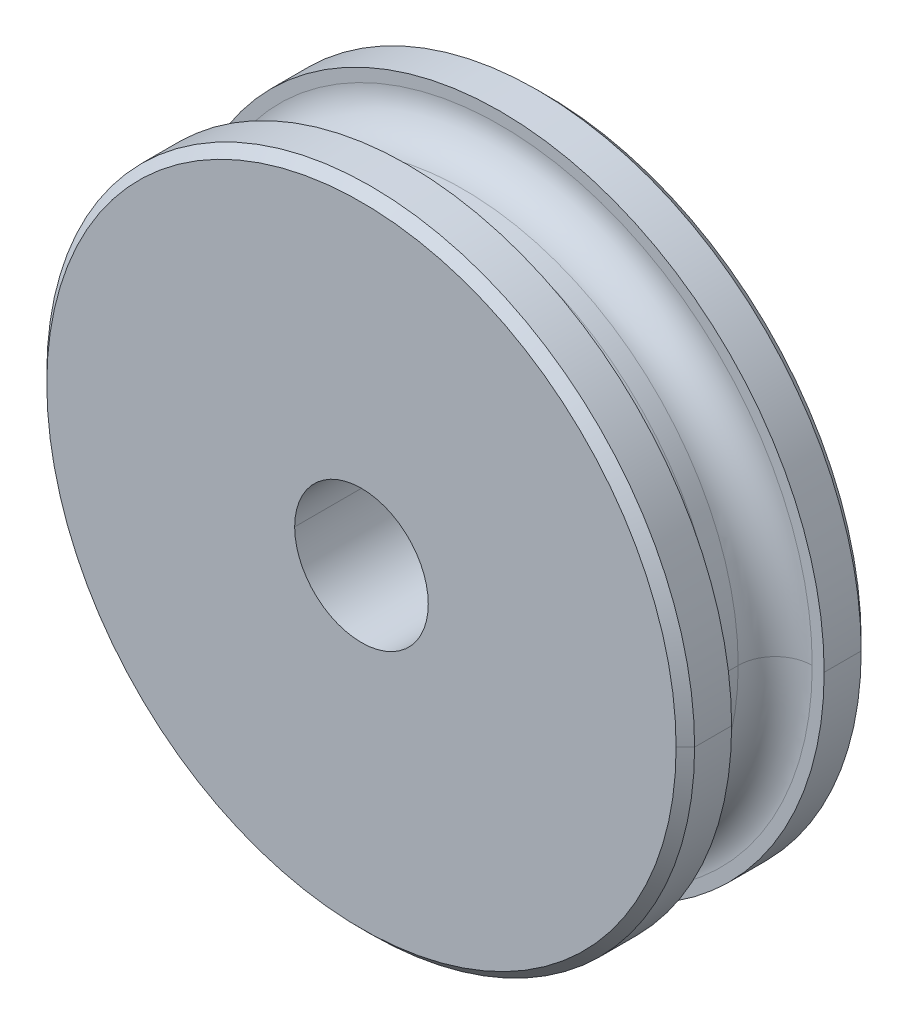
ISO-10303-21;
HEADER;
FILE_DESCRIPTION(('STEP AP214'),'2;1');
FILE_NAME('part.step','',(''),(''),'','','');
FILE_SCHEMA(('AUTOMOTIVE_DESIGN { 1 0 10303 214 1 1 1 1 }'));
ENDSEC;
DATA;
#1=APPLICATION_CONTEXT('core data for automotive mechanical design processes');
#2=APPLICATION_PROTOCOL_DEFINITION('international standard','automotive_design',2000,#1);
#3=PRODUCT_CONTEXT('',#1,'mechanical');
#4=PRODUCT('Part','Part','',(#3));
#5=PRODUCT_RELATED_PRODUCT_CATEGORY('part','',(#4));
#6=PRODUCT_DEFINITION_FORMATION('','',#4);
#7=PRODUCT_DEFINITION_CONTEXT('part definition',#1,'design');
#8=PRODUCT_DEFINITION('design','',#6,#7);
#9=PRODUCT_DEFINITION_SHAPE('','',#8);
#10=(LENGTH_UNIT() NAMED_UNIT(*) SI_UNIT(.MILLI.,.METRE.));
#11=(NAMED_UNIT(*) PLANE_ANGLE_UNIT() SI_UNIT($,.RADIAN.));
#12=(NAMED_UNIT(*) SI_UNIT($,.STERADIAN.) SOLID_ANGLE_UNIT());
#13=UNCERTAINTY_MEASURE_WITH_UNIT(LENGTH_MEASURE(1.E-05),#10,'distance_accuracy_value','');
#14=(GEOMETRIC_REPRESENTATION_CONTEXT(3) GLOBAL_UNCERTAINTY_ASSIGNED_CONTEXT((#13)) GLOBAL_UNIT_ASSIGNED_CONTEXT((#10,
#11,#12)) REPRESENTATION_CONTEXT('',''));
#15=CARTESIAN_POINT('',(0.,0.,0.));
#16=DIRECTION('',(0.,0.,1.));
#17=DIRECTION('',(1.,0.,0.));
#18=AXIS2_PLACEMENT_3D('',#15,#16,#17);
#19=CARTESIAN_POINT('',(2813.58845603353,799.187242222488,-1.99999999999889));
#20=DIRECTION('',(0.,0.,1.));
#21=DIRECTION('',(0.999986330920326,-0.00522857270246895,0.));
#22=AXIS2_PLACEMENT_3D('',#19,#20,#21);
#23=TOROIDAL_SURFACE('',#22,67.4206294946856,8.);
#24=CARTESIAN_POINT('',(2813.58845603353,799.187242222488,-1.99999999999889));
#25=DIRECTION('',(0.,0.,1.));
#26=DIRECTION('',(1.,0.,0.));
#27=AXIS2_PLACEMENT_3D('',#24,#25,#26);
#28=CIRCLE('',#27,59.4206294946865);
#29=CARTESIAN_POINT('',(2873.00908552821,799.187242222497,-1.99999999999889));
#30=VERTEX_POINT('',#29);
#31=CARTESIAN_POINT('',(2754.16782653884,799.187242222484,-2.00000000000022));
#32=VERTEX_POINT('',#31);
#33=EDGE_CURVE('E118',#30,#32,#28,.T.);
#34=ORIENTED_EDGE('',*,*,#33,.F.);
#35=CARTESIAN_POINT('',(2881.00908552821,799.187242222525,-1.99999999999889));
#36=DIRECTION('',(-5.50448575609153E-13,1.,0.));
#37=DIRECTION('',(1.,5.55666623824891E-13,0.));
#38=AXIS2_PLACEMENT_3D('',#35,#36,#37);
#39=CIRCLE('',#38,8.);
#40=CARTESIAN_POINT('',(2881.00908552821,799.187242222503,-9.9999999999989));
#41=VERTEX_POINT('',#40);
#42=EDGE_CURVE('E111',#30,#41,#39,.F.);
#43=ORIENTED_EDGE('',*,*,#42,.T.);
#44=CARTESIAN_POINT('',(2813.58845603353,799.187242222488,-9.99999999999891));
#45=DIRECTION('',(0.,0.,1.));
#46=DIRECTION('',(1.,0.,0.));
#47=AXIS2_PLACEMENT_3D('',#44,#45,#46);
#48=CIRCLE('',#47,67.420629494686);
#49=CARTESIAN_POINT('',(2746.16782653884,799.187242222481,-10.0000000000002));
#50=VERTEX_POINT('',#49);
#51=EDGE_CURVE('E105',#50,#41,#48,.F.);
#52=ORIENTED_EDGE('',*,*,#51,.F.);
#53=CARTESIAN_POINT('',(2746.16782653884,799.187242222489,-2.00000000000022));
#54=DIRECTION('',(0.,-1.,0.));
#55=DIRECTION('',(-1.,0.,0.));
#56=AXIS2_PLACEMENT_3D('',#53,#54,#55);
#57=CIRCLE('',#56,8.);
#58=EDGE_CURVE('E109',#50,#32,#57,.T.);
#59=ORIENTED_EDGE('',*,*,#58,.T.);
#60=EDGE_LOOP('',(#34,#43,#52,#59));
#61=FACE_BOUND('',#60,.T.);
#62=ADVANCED_FACE('F16',(#61),#23,.F.);
#63=CARTESIAN_POINT('',(2813.58845603353,799.187242222488,-2.00000000000022));
#64=DIRECTION('',(0.,0.,1.));
#65=DIRECTION('',(-0.999986330920326,0.00522857270247547,0.));
#66=AXIS2_PLACEMENT_3D('',#63,#64,#65);
#67=TOROIDAL_SURFACE('',#66,67.4206294946865,8.);
#68=CARTESIAN_POINT('',(2813.58845603353,799.187242222488,-1.99999999999889));
#69=DIRECTION('',(0.,0.,1.));
#70=DIRECTION('',(1.,0.,0.));
#71=AXIS2_PLACEMENT_3D('',#68,#69,#70);
#72=CIRCLE('',#71,59.4206294946865);
#73=EDGE_CURVE('E123',#32,#30,#72,.T.);
#74=ORIENTED_EDGE('',*,*,#73,.F.);
#75=ORIENTED_EDGE('',*,*,#58,.F.);
#76=CARTESIAN_POINT('',(2813.58845603353,799.187242222488,-10.0000000000002));
#77=DIRECTION('',(0.,0.,1.));
#78=DIRECTION('',(-1.,0.,0.));
#79=AXIS2_PLACEMENT_3D('',#76,#77,#78);
#80=CIRCLE('',#79,67.4206294946864);
#81=EDGE_CURVE('E117',#41,#50,#80,.F.);
#82=ORIENTED_EDGE('',*,*,#81,.F.);
#83=ORIENTED_EDGE('',*,*,#42,.F.);
#84=EDGE_LOOP('',(#74,#75,#82,#83));
#85=FACE_BOUND('',#84,.T.);
#86=ADVANCED_FACE('F121',(#85),#67,.F.);
#87=CARTESIAN_POINT('',(2813.58845603353,799.187242222488,10.0000000000011));
#88=DIRECTION('',(0.,0.,1.));
#89=DIRECTION('',(1.,0.,0.));
#90=AXIS2_PLACEMENT_3D('',#87,#88,#89);
#91=CYLINDRICAL_SURFACE('',#90,59.4206294946865);
#92=DIRECTION('',(0.,0.,1.));
#93=VECTOR('',#92,1.);
#94=CARTESIAN_POINT('',(2754.16782653884,799.187242222488,9.99999999999979));
#95=LINE('',#94,#93);
#96=CARTESIAN_POINT('',(2754.16782653884,799.187242222492,1.99999999999978));
#97=VERTEX_POINT('',#96);
#98=EDGE_CURVE('E185',#32,#97,#95,.T.);
#99=ORIENTED_EDGE('',*,*,#98,.F.);
#100=ORIENTED_EDGE('',*,*,#73,.T.);
#101=DIRECTION('',(0.,0.,1.));
#102=VECTOR('',#101,1.);
#103=CARTESIAN_POINT('',(2873.00908552821,799.187242222488,10.0000000000011));
#104=LINE('',#103,#102);
#105=CARTESIAN_POINT('',(2873.00908552821,799.187242222475,2.00000000000111));
#106=VERTEX_POINT('',#105);
#107=EDGE_CURVE('E88',#106,#30,#104,.F.);
#108=ORIENTED_EDGE('',*,*,#107,.F.);
#109=CARTESIAN_POINT('',(2813.58845603353,799.187242222488,2.00000000000111));
#110=DIRECTION('',(0.,0.,1.));
#111=DIRECTION('',(0.99997241615736,0.00742744400270856,0.));
#112=AXIS2_PLACEMENT_3D('',#109,#110,#111);
#113=CIRCLE('',#112,59.4206294946864);
#114=EDGE_CURVE('E130',#106,#97,#113,.F.);
#115=ORIENTED_EDGE('',*,*,#114,.T.);
#116=EDGE_LOOP('',(#99,#100,#108,#115));
#117=FACE_BOUND('',#116,.T.);
#118=ADVANCED_FACE('F157',(#117),#91,.T.);
#119=CARTESIAN_POINT('',(2813.58845603353,799.187242222488,10.0000000000011));
#120=DIRECTION('',(0.,0.,1.));
#121=DIRECTION('',(1.,0.,0.));
#122=AXIS2_PLACEMENT_3D('',#119,#120,#121);
#123=CYLINDRICAL_SURFACE('',#122,59.4206294946865);
#124=ORIENTED_EDGE('',*,*,#107,.T.);
#125=ORIENTED_EDGE('',*,*,#33,.T.);
#126=ORIENTED_EDGE('',*,*,#98,.T.);
#127=CARTESIAN_POINT('',(2813.58845603353,799.187242222488,2.00000000000111));
#128=DIRECTION('',(0.,0.,1.));
#129=DIRECTION('',(-0.99997241615736,-0.00742744400271039,0.));
#130=AXIS2_PLACEMENT_3D('',#127,#128,#129);
#131=CIRCLE('',#130,59.4206294946864);
#132=EDGE_CURVE('E280',#97,#106,#131,.F.);
#133=ORIENTED_EDGE('',*,*,#132,.T.);
#134=EDGE_LOOP('',(#124,#125,#126,#133));
#135=FACE_BOUND('',#134,.T.);
#136=ADVANCED_FACE('F150',(#135),#123,.T.);
#137=CARTESIAN_POINT('',(0.,3.33066907387547E-13,-9.99999999999979));
#138=DIRECTION('',(0.,0.,1.));
#139=DIRECTION('',(1.,0.,0.));
#140=AXIS2_PLACEMENT_3D('',#137,#138,#139);
#141=PLANE('',#140);
#142=ORIENTED_EDGE('',*,*,#51,.T.);
#143=ORIENTED_EDGE('',*,*,#81,.T.);
#144=EDGE_LOOP('',(#142,#143));
#145=FACE_BOUND('',#144,.T.);
#146=CARTESIAN_POINT('',(2813.58845603353,799.187242222488,-9.9999999999989));
#147=DIRECTION('',(0.,0.,1.));
#148=DIRECTION('',(1.,0.,0.));
#149=AXIS2_PLACEMENT_3D('',#146,#147,#148);
#150=CIRCLE('',#149,70.);
#151=CARTESIAN_POINT('',(2883.58845603353,799.187242222488,-9.9999999999989));
#152=VERTEX_POINT('',#151);
#153=CARTESIAN_POINT('',(2743.58845603353,799.187242222488,-10.0000000000002));
#154=VERTEX_POINT('',#153);
#155=EDGE_CURVE('E21',#152,#154,#150,.F.);
#156=ORIENTED_EDGE('',*,*,#155,.F.);
#157=CARTESIAN_POINT('',(2813.58845603353,799.187242222488,-9.9999999999989));
#158=DIRECTION('',(0.,0.,1.));
#159=DIRECTION('',(1.,0.,0.));
#160=AXIS2_PLACEMENT_3D('',#157,#158,#159);
#161=CIRCLE('',#160,70.);
#162=EDGE_CURVE('E236',#154,#152,#161,.F.);
#163=ORIENTED_EDGE('',*,*,#162,.F.);
#164=EDGE_LOOP('',(#156,#163));
#165=FACE_BOUND('',#164,.T.);
#166=ADVANCED_FACE('F128',(#145,#165),#141,.T.);
#167=CARTESIAN_POINT('',(2813.58845603353,799.187242222488,2.00000000000111));
#168=DIRECTION('',(0.,0.,1.));
#169=DIRECTION('',(0.999972416157359,0.00742744400271087,0.));
#170=AXIS2_PLACEMENT_3D('',#167,#168,#169);
#171=TOROIDAL_SURFACE('',#170,67.4206294946858,8.);
#172=ORIENTED_EDGE('',*,*,#114,.F.);
#173=CARTESIAN_POINT('',(2881.00908552821,799.187242222468,2.00000000000111));
#174=DIRECTION('',(2.95319324550292E-13,1.,0.));
#175=DIRECTION('',(1.,-2.9171109972026E-13,0.));
#176=AXIS2_PLACEMENT_3D('',#173,#174,#175);
#177=CIRCLE('',#176,8.);
#178=CARTESIAN_POINT('',(2881.00908552821,799.187242222481,10.0000000000011));
#179=VERTEX_POINT('',#178);
#180=EDGE_CURVE('E253',#106,#179,#177,.T.);
#181=ORIENTED_EDGE('',*,*,#180,.T.);
#182=CARTESIAN_POINT('',(2813.58845603353,799.187242222488,10.0000000000011));
#183=DIRECTION('',(0.,0.,-1.));
#184=DIRECTION('',(1.,0.,0.));
#185=AXIS2_PLACEMENT_3D('',#182,#183,#184);
#186=CIRCLE('',#185,67.420629494686);
#187=CARTESIAN_POINT('',(2746.16782653884,799.187242222492,9.99999999999979));
#188=VERTEX_POINT('',#187);
#189=EDGE_CURVE('E247',#179,#188,#186,.T.);
#190=ORIENTED_EDGE('',*,*,#189,.T.);
#191=CARTESIAN_POINT('',(2746.16782653884,799.187242222487,1.99999999999978));
#192=DIRECTION('',(0.,-1.,0.));
#193=DIRECTION('',(-1.,0.,0.));
#194=AXIS2_PLACEMENT_3D('',#191,#192,#193);
#195=CIRCLE('',#194,8.);
#196=EDGE_CURVE('E283',#188,#97,#195,.F.);
#197=ORIENTED_EDGE('',*,*,#196,.T.);
#198=EDGE_LOOP('',(#172,#181,#190,#197));
#199=FACE_BOUND('',#198,.T.);
#200=ADVANCED_FACE('F149',(#199),#171,.F.);
#201=CARTESIAN_POINT('',(2813.58845603353,799.187242222488,1.99999999999978));
#202=DIRECTION('',(0.,0.,1.));
#203=DIRECTION('',(-0.999972416157359,-0.00742744400270588,0.));
#204=AXIS2_PLACEMENT_3D('',#201,#202,#203);
#205=TOROIDAL_SURFACE('',#204,67.4206294946863,8.);
#206=ORIENTED_EDGE('',*,*,#132,.F.);
#207=ORIENTED_EDGE('',*,*,#196,.F.);
#208=CARTESIAN_POINT('',(2813.58845603353,799.187242222488,9.99999999999979));
#209=DIRECTION('',(0.,0.,-1.));
#210=DIRECTION('',(-1.,0.,0.));
#211=AXIS2_PLACEMENT_3D('',#208,#209,#210);
#212=CIRCLE('',#211,67.420629494686);
#213=EDGE_CURVE('E309',#188,#179,#212,.T.);
#214=ORIENTED_EDGE('',*,*,#213,.T.);
#215=ORIENTED_EDGE('',*,*,#180,.F.);
#216=EDGE_LOOP('',(#206,#207,#214,#215));
#217=FACE_BOUND('',#216,.T.);
#218=ADVANCED_FACE('F263',(#217),#205,.F.);
#219=CARTESIAN_POINT('',(2813.58845603353,799.187242222488,-19.9999999999987));
#220=DIRECTION('',(0.,0.,1.));
#221=DIRECTION('',(1.,0.,0.));
#222=AXIS2_PLACEMENT_3D('',#219,#220,#221);
#223=CYLINDRICAL_SURFACE('',#222,70.);
#224=DIRECTION('',(0.,0.,1.));
#225=VECTOR('',#224,1.);
#226=CARTESIAN_POINT('',(2743.58845603353,799.187242222488,-20.));
#227=LINE('',#226,#225);
#228=CARTESIAN_POINT('',(2743.58845603385,799.187242182791,-18.0000000004483));
#229=VERTEX_POINT('',#228);
#230=EDGE_CURVE('E240',#229,#154,#227,.T.);
#231=ORIENTED_EDGE('',*,*,#230,.F.);
#232=CARTESIAN_POINT('',(2813.58845603353,799.187242222488,-18.0000000004257));
#233=DIRECTION('',(0.,0.,1.));
#234=DIRECTION('',(0.,-1.,0.));
#235=AXIS2_PLACEMENT_3D('',#232,#233,#234);
#236=CIRCLE('',#235,69.9999999995816);
#237=CARTESIAN_POINT('',(2883.58845603319,799.187242147957,-18.0000000003333));
#238=VERTEX_POINT('',#237);
#239=EDGE_CURVE('E315',#238,#229,#236,.F.);
#240=ORIENTED_EDGE('',*,*,#239,.F.);
#241=DIRECTION('',(0.,0.,1.));
#242=VECTOR('',#241,1.);
#243=CARTESIAN_POINT('',(2883.58845603353,799.187242222488,-19.9999999999987));
#244=LINE('',#243,#242);
#245=EDGE_CURVE('E239',#152,#238,#244,.F.);
#246=ORIENTED_EDGE('',*,*,#245,.F.);
#247=ORIENTED_EDGE('',*,*,#155,.T.);
#248=EDGE_LOOP('',(#231,#240,#246,#247));
#249=FACE_BOUND('',#248,.T.);
#250=ADVANCED_FACE('F267',(#249),#223,.T.);
#251=CARTESIAN_POINT('',(2813.58845603353,799.187242222488,-19.9999999999987));
#252=DIRECTION('',(0.,0.,1.));
#253=DIRECTION('',(1.,0.,0.));
#254=AXIS2_PLACEMENT_3D('',#251,#252,#253);
#255=CYLINDRICAL_SURFACE('',#254,70.);
#256=ORIENTED_EDGE('',*,*,#245,.T.);
#257=CARTESIAN_POINT('',(2813.58845603353,799.187242222488,-18.0000000004257));
#258=DIRECTION('',(0.,0.,1.));
#259=DIRECTION('',(0.,-1.,0.));
#260=AXIS2_PLACEMENT_3D('',#257,#258,#259);
#261=CIRCLE('',#260,69.9999999995816);
#262=EDGE_CURVE('E389',#229,#238,#261,.F.);
#263=ORIENTED_EDGE('',*,*,#262,.F.);
#264=ORIENTED_EDGE('',*,*,#230,.T.);
#265=ORIENTED_EDGE('',*,*,#162,.T.);
#266=EDGE_LOOP('',(#256,#263,#264,#265));
#267=FACE_BOUND('',#266,.T.);
#268=ADVANCED_FACE('F334',(#267),#255,.T.);
#269=CARTESIAN_POINT('',(0.,0.,9.99999999999979));
#270=DIRECTION('',(0.,0.,1.));
#271=DIRECTION('',(1.,0.,0.));
#272=AXIS2_PLACEMENT_3D('',#269,#270,#271);
#273=PLANE('',#272);
#274=ORIENTED_EDGE('',*,*,#189,.F.);
#275=ORIENTED_EDGE('',*,*,#213,.F.);
#276=EDGE_LOOP('',(#274,#275));
#277=FACE_BOUND('',#276,.T.);
#278=CARTESIAN_POINT('',(2813.58845603353,799.187242222488,10.0000000000011));
#279=DIRECTION('',(0.,0.,1.));
#280=DIRECTION('',(1.,0.,0.));
#281=AXIS2_PLACEMENT_3D('',#278,#279,#280);
#282=CIRCLE('',#281,70.);
#283=CARTESIAN_POINT('',(2883.58845603353,799.187242222488,10.0000000000011));
#284=VERTEX_POINT('',#283);
#285=CARTESIAN_POINT('',(2743.58845603353,799.187242222488,9.99999999999979));
#286=VERTEX_POINT('',#285);
#287=EDGE_CURVE('E233',#284,#286,#282,.T.);
#288=ORIENTED_EDGE('',*,*,#287,.F.);
#289=CARTESIAN_POINT('',(2813.58845603353,799.187242222488,10.0000000000011));
#290=DIRECTION('',(0.,0.,1.));
#291=DIRECTION('',(1.,0.,0.));
#292=AXIS2_PLACEMENT_3D('',#289,#290,#291);
#293=CIRCLE('',#292,70.);
#294=EDGE_CURVE('E228',#286,#284,#293,.T.);
#295=ORIENTED_EDGE('',*,*,#294,.F.);
#296=EDGE_LOOP('',(#288,#295));
#297=FACE_BOUND('',#296,.T.);
#298=ADVANCED_FACE('F312',(#277,#297),#273,.F.);
#299=CARTESIAN_POINT('',(2813.58845603353,799.187242222488,-18.0000000004825));
#300=DIRECTION('',(0.,0.,1.));
#301=DIRECTION('',(1.,0.,0.));
#302=AXIS2_PLACEMENT_3D('',#299,#300,#301);
#303=CONICAL_SURFACE('',#302,69.9999999995248,0.785398163397448);
#304=DIRECTION('',(0.707106781186548,1.30392469044338E-09,-0.707106781186548));
#305=VECTOR('',#304,1.);
#306=CARTESIAN_POINT('',(-496274.411543967,799.186321890323,499000.));
#307=LINE('',#306,#305);
#308=CARTESIAN_POINT('',(2745.58845603372,799.187242097094,-20.0000000002092));
#309=VERTEX_POINT('',#308);
#310=EDGE_CURVE('E394',#309,#229,#307,.F.);
#311=ORIENTED_EDGE('',*,*,#310,.F.);
#312=CARTESIAN_POINT('',(2813.58845603353,799.187242222488,-20.0000000002079));
#313=DIRECTION('',(0.,0.,1.));
#314=DIRECTION('',(1.,0.,0.));
#315=AXIS2_PLACEMENT_3D('',#312,#313,#314);
#316=CIRCLE('',#315,67.9999999997994);
#317=CARTESIAN_POINT('',(2881.5884560333,799.187242236918,-20.0000000002079));
#318=VERTEX_POINT('',#317);
#319=EDGE_CURVE('E224',#309,#318,#316,.T.);
#320=ORIENTED_EDGE('',*,*,#319,.T.);
#321=DIRECTION('',(-0.707106781186548,1.00383756862499E-09,-0.707106781186548));
#322=VECTOR('',#321,1.);
#323=CARTESIAN_POINT('',(501901.588456034,799.18653369686,499000.));
#324=LINE('',#323,#322);
#325=EDGE_CURVE('E235',#238,#318,#324,.T.);
#326=ORIENTED_EDGE('',*,*,#325,.F.);
#327=ORIENTED_EDGE('',*,*,#239,.T.);
#328=EDGE_LOOP('',(#311,#320,#326,#327));
#329=FACE_BOUND('',#328,.T.);
#330=ADVANCED_FACE('F333',(#329),#303,.T.);
#331=CARTESIAN_POINT('',(2813.58845603353,799.187242222488,-18.0000000004825));
#332=DIRECTION('',(0.,0.,1.));
#333=DIRECTION('',(1.,0.,0.));
#334=AXIS2_PLACEMENT_3D('',#331,#332,#333);
#335=CONICAL_SURFACE('',#334,69.9999999995248,0.785398163397448);
#336=ORIENTED_EDGE('',*,*,#325,.T.);
#337=CARTESIAN_POINT('',(2813.58845603353,799.187242222488,-20.0000000002079));
#338=DIRECTION('',(0.,0.,1.));
#339=DIRECTION('',(1.,0.,0.));
#340=AXIS2_PLACEMENT_3D('',#337,#338,#339);
#341=CIRCLE('',#340,67.9999999997994);
#342=EDGE_CURVE('E219',#318,#309,#341,.T.);
#343=ORIENTED_EDGE('',*,*,#342,.T.);
#344=ORIENTED_EDGE('',*,*,#310,.T.);
#345=ORIENTED_EDGE('',*,*,#262,.T.);
#346=EDGE_LOOP('',(#336,#343,#344,#345));
#347=FACE_BOUND('',#346,.T.);
#348=ADVANCED_FACE('F375',(#347),#335,.T.);
#349=CARTESIAN_POINT('',(2813.58845603353,799.187242222488,-19.9999999999987));
#350=DIRECTION('',(0.,0.,1.));
#351=DIRECTION('',(1.,0.,0.));
#352=AXIS2_PLACEMENT_3D('',#349,#350,#351);
#353=CYLINDRICAL_SURFACE('',#352,70.);
#354=DIRECTION('',(0.,0.,1.));
#355=VECTOR('',#354,1.);
#356=CARTESIAN_POINT('',(2743.58845603353,799.187242222488,-20.));
#357=LINE('',#356,#355);
#358=CARTESIAN_POINT('',(2743.58845603374,799.187242239905,18.0000000002991));
#359=VERTEX_POINT('',#358);
#360=EDGE_CURVE('E232',#359,#286,#357,.F.);
#361=ORIENTED_EDGE('',*,*,#360,.F.);
#362=CARTESIAN_POINT('',(2813.58845603353,799.187242222488,18.0000000002578));
#363=DIRECTION('',(0.,0.,-1.));
#364=DIRECTION('',(0.,-1.,0.));
#365=AXIS2_PLACEMENT_3D('',#362,#363,#364);
#366=CIRCLE('',#365,69.9999999997521);
#367=CARTESIAN_POINT('',(2883.58845603332,799.1872423193,18.0000000002218));
#368=VERTEX_POINT('',#367);
#369=EDGE_CURVE('E223',#368,#359,#366,.F.);
#370=ORIENTED_EDGE('',*,*,#369,.F.);
#371=DIRECTION('',(0.,0.,1.));
#372=VECTOR('',#371,1.);
#373=CARTESIAN_POINT('',(2883.58845603353,799.187242222488,-19.9999999999987));
#374=LINE('',#373,#372);
#375=EDGE_CURVE('E227',#284,#368,#374,.T.);
#376=ORIENTED_EDGE('',*,*,#375,.F.);
#377=ORIENTED_EDGE('',*,*,#287,.T.);
#378=EDGE_LOOP('',(#361,#370,#376,#377));
#379=FACE_BOUND('',#378,.T.);
#380=ADVANCED_FACE('F372',(#379),#353,.T.);
#381=CARTESIAN_POINT('',(2813.58845603353,799.187242222488,-19.9999999999987));
#382=DIRECTION('',(0.,0.,1.));
#383=DIRECTION('',(1.,0.,0.));
#384=AXIS2_PLACEMENT_3D('',#381,#382,#383);
#385=CYLINDRICAL_SURFACE('',#384,70.);
#386=ORIENTED_EDGE('',*,*,#375,.T.);
#387=CARTESIAN_POINT('',(2813.58845603353,799.187242222488,18.0000000002578));
#388=DIRECTION('',(0.,0.,-1.));
#389=DIRECTION('',(0.,-1.,0.));
#390=AXIS2_PLACEMENT_3D('',#387,#388,#389);
#391=CIRCLE('',#390,69.9999999997521);
#392=EDGE_CURVE('E419',#359,#368,#391,.F.);
#393=ORIENTED_EDGE('',*,*,#392,.F.);
#394=ORIENTED_EDGE('',*,*,#360,.T.);
#395=ORIENTED_EDGE('',*,*,#294,.T.);
#396=EDGE_LOOP('',(#386,#393,#394,#395));
#397=FACE_BOUND('',#396,.T.);
#398=ADVANCED_FACE('F368',(#397),#385,.T.);
#399=CARTESIAN_POINT('',(0.,3.33066907387547E-13,-20.));
#400=DIRECTION('',(0.,0.,1.));
#401=DIRECTION('',(1.,0.,0.));
#402=AXIS2_PLACEMENT_3D('',#399,#400,#401);
#403=PLANE('',#402);
#404=CARTESIAN_POINT('',(2813.58845603353,799.187242222488,-19.9999999999987));
#405=DIRECTION('',(0.,0.,1.));
#406=DIRECTION('',(1.,0.,0.));
#407=AXIS2_PLACEMENT_3D('',#404,#405,#406);
#408=CIRCLE('',#407,14.4381275614838);
#409=CARTESIAN_POINT('',(2828.02658359501,799.187242222489,-19.9999999999987));
#410=VERTEX_POINT('',#409);
#411=CARTESIAN_POINT('',(2799.15032847204,799.187242222488,-20.));
#412=VERTEX_POINT('',#411);
#413=EDGE_CURVE('E212',#410,#412,#408,.T.);
#414=ORIENTED_EDGE('',*,*,#413,.T.);
#415=CARTESIAN_POINT('',(2813.58845603353,799.187242222488,-19.9999999999987));
#416=DIRECTION('',(0.,0.,1.));
#417=DIRECTION('',(1.,0.,0.));
#418=AXIS2_PLACEMENT_3D('',#415,#416,#417);
#419=CIRCLE('',#418,14.4381275614838);
#420=EDGE_CURVE('E215',#412,#410,#419,.T.);
#421=ORIENTED_EDGE('',*,*,#420,.T.);
#422=EDGE_LOOP('',(#414,#421));
#423=FACE_BOUND('',#422,.T.);
#424=ORIENTED_EDGE('',*,*,#319,.F.);
#425=ORIENTED_EDGE('',*,*,#342,.F.);
#426=EDGE_LOOP('',(#424,#425));
#427=FACE_BOUND('',#426,.T.);
#428=ADVANCED_FACE('F364',(#423,#427),#403,.F.);
#429=CARTESIAN_POINT('',(2813.58845603353,799.187242222488,18.0000000003715));
#430=DIRECTION('',(0.,0.,-1.));
#431=DIRECTION('',(-1.,0.,0.));
#432=AXIS2_PLACEMENT_3D('',#429,#430,#431);
#433=CONICAL_SURFACE('',#432,69.9999999996385,0.785398163397448);
#434=DIRECTION('',(0.707106781186548,-1.00383751311384E-09,0.707106781186548));
#435=VECTOR('',#434,1.);
#436=CARTESIAN_POINT('',(-496274.411543967,799.187950747984,-499000.));
#437=LINE('',#436,#435);
#438=CARTESIAN_POINT('',(2745.58845603395,799.187242319024,20.0000000004366));
#439=VERTEX_POINT('',#438);
#440=EDGE_CURVE('E423',#439,#359,#437,.F.);
#441=ORIENTED_EDGE('',*,*,#440,.F.);
#442=CARTESIAN_POINT('',(2813.58845603353,799.187242222488,20.0000000004379));
#443=DIRECTION('',(0.,0.,-1.));
#444=DIRECTION('',(-1.,0.,0.));
#445=AXIS2_PLACEMENT_3D('',#442,#443,#444);
#446=CIRCLE('',#445,67.9999999995721);
#447=CARTESIAN_POINT('',(2881.5884560331,799.187242236918,20.0000000004379));
#448=VERTEX_POINT('',#447);
#449=EDGE_CURVE('E207',#448,#439,#446,.F.);
#450=ORIENTED_EDGE('',*,*,#449,.F.);
#451=DIRECTION('',(-0.707106781186548,-1.30392366348708E-09,0.707106781186548));
#452=VECTOR('',#451,1.);
#453=CARTESIAN_POINT('',(501901.588456034,799.188162553952,-499000.));
#454=LINE('',#453,#452);
#455=EDGE_CURVE('E218',#368,#448,#454,.T.);
#456=ORIENTED_EDGE('',*,*,#455,.F.);
#457=ORIENTED_EDGE('',*,*,#369,.T.);
#458=EDGE_LOOP('',(#441,#450,#456,#457));
#459=FACE_BOUND('',#458,.T.);
#460=ADVANCED_FACE('F360',(#459),#433,.T.);
#461=CARTESIAN_POINT('',(2813.58845603353,799.187242222488,18.0000000003715));
#462=DIRECTION('',(0.,0.,-1.));
#463=DIRECTION('',(-1.,0.,0.));
#464=AXIS2_PLACEMENT_3D('',#461,#462,#463);
#465=CONICAL_SURFACE('',#464,69.9999999996385,0.785398163397448);
#466=ORIENTED_EDGE('',*,*,#455,.T.);
#467=CARTESIAN_POINT('',(2813.58845603353,799.187242222488,20.0000000004379));
#468=DIRECTION('',(0.,0.,-1.));
#469=DIRECTION('',(-1.,0.,0.));
#470=AXIS2_PLACEMENT_3D('',#467,#468,#469);
#471=CIRCLE('',#470,67.9999999995721);
#472=EDGE_CURVE('E203',#439,#448,#471,.F.);
#473=ORIENTED_EDGE('',*,*,#472,.F.);
#474=ORIENTED_EDGE('',*,*,#440,.T.);
#475=ORIENTED_EDGE('',*,*,#392,.T.);
#476=EDGE_LOOP('',(#466,#473,#474,#475));
#477=FACE_BOUND('',#476,.T.);
#478=ADVANCED_FACE('F357',(#477),#465,.T.);
#479=CARTESIAN_POINT('',(2813.58845603353,799.187242222488,20.0000000000014));
#480=DIRECTION('',(0.,0.,1.));
#481=DIRECTION('',(1.,0.,0.));
#482=AXIS2_PLACEMENT_3D('',#479,#480,#481);
#483=CYLINDRICAL_SURFACE('',#482,14.4381275614838);
#484=CARTESIAN_POINT('',(2813.58845603353,799.187242222488,20.0000000000014));
#485=DIRECTION('',(0.,0.,1.));
#486=DIRECTION('',(1.,0.,0.));
#487=AXIS2_PLACEMENT_3D('',#484,#485,#486);
#488=CIRCLE('',#487,14.4381275614838);
#489=CARTESIAN_POINT('',(2828.02658359501,799.187242222488,20.0000000000014));
#490=VERTEX_POINT('',#489);
#491=CARTESIAN_POINT('',(2799.15032847204,799.187242222488,20.));
#492=VERTEX_POINT('',#491);
#493=EDGE_CURVE('E28',#490,#492,#488,.F.);
#494=ORIENTED_EDGE('',*,*,#493,.F.);
#495=DIRECTION('',(0.,0.,1.));
#496=VECTOR('',#495,1.);
#497=CARTESIAN_POINT('',(2828.02658359501,799.187242222488,20.0000000000014));
#498=LINE('',#497,#496);
#499=EDGE_CURVE('E211',#490,#410,#498,.F.);
#500=ORIENTED_EDGE('',*,*,#499,.T.);
#501=ORIENTED_EDGE('',*,*,#420,.F.);
#502=DIRECTION('',(0.,0.,1.));
#503=VECTOR('',#502,1.);
#504=CARTESIAN_POINT('',(2799.15032847204,799.187242222488,20.));
#505=LINE('',#504,#503);
#506=EDGE_CURVE('E37',#412,#492,#505,.T.);
#507=ORIENTED_EDGE('',*,*,#506,.T.);
#508=EDGE_LOOP('',(#494,#500,#501,#507));
#509=FACE_BOUND('',#508,.T.);
#510=ADVANCED_FACE('F350',(#509),#483,.F.);
#511=CARTESIAN_POINT('',(2813.58845603353,799.187242222488,20.0000000000014));
#512=DIRECTION('',(0.,0.,1.));
#513=DIRECTION('',(1.,0.,0.));
#514=AXIS2_PLACEMENT_3D('',#511,#512,#513);
#515=CYLINDRICAL_SURFACE('',#514,14.4381275614838);
#516=CARTESIAN_POINT('',(2813.58845603353,799.187242222488,20.0000000000014));
#517=DIRECTION('',(0.,0.,1.));
#518=DIRECTION('',(1.,0.,0.));
#519=AXIS2_PLACEMENT_3D('',#516,#517,#518);
#520=CIRCLE('',#519,14.4381275614838);
#521=EDGE_CURVE('E11',#492,#490,#520,.F.);
#522=ORIENTED_EDGE('',*,*,#521,.F.);
#523=ORIENTED_EDGE('',*,*,#506,.F.);
#524=ORIENTED_EDGE('',*,*,#413,.F.);
#525=ORIENTED_EDGE('',*,*,#499,.F.);
#526=EDGE_LOOP('',(#522,#523,#524,#525));
#527=FACE_BOUND('',#526,.T.);
#528=ADVANCED_FACE('F344',(#527),#515,.F.);
#529=CARTESIAN_POINT('',(0.,0.,20.));
#530=DIRECTION('',(0.,0.,1.));
#531=DIRECTION('',(1.,0.,0.));
#532=AXIS2_PLACEMENT_3D('',#529,#530,#531);
#533=PLANE('',#532);
#534=ORIENTED_EDGE('',*,*,#493,.T.);
#535=ORIENTED_EDGE('',*,*,#521,.T.);
#536=EDGE_LOOP('',(#534,#535));
#537=FACE_BOUND('',#536,.T.);
#538=ORIENTED_EDGE('',*,*,#449,.T.);
#539=ORIENTED_EDGE('',*,*,#472,.T.);
#540=EDGE_LOOP('',(#538,#539));
#541=FACE_BOUND('',#540,.T.);
#542=ADVANCED_FACE('F342',(#537,#541),#533,.T.);
#543=CLOSED_SHELL('',(#62,#86,#118,#136,#166,#200,#218,#250,#268,#298,#330,#348,#380,#398,#428,
#460,#478,#510,#528,#542));
#544=MANIFOLD_SOLID_BREP('B1',#543);
#545=ADVANCED_BREP_SHAPE_REPRESENTATION('',(#18,#544),#14);
#546=SHAPE_DEFINITION_REPRESENTATION(#9,#545);
ENDSEC;
END-ISO-10303-21;
